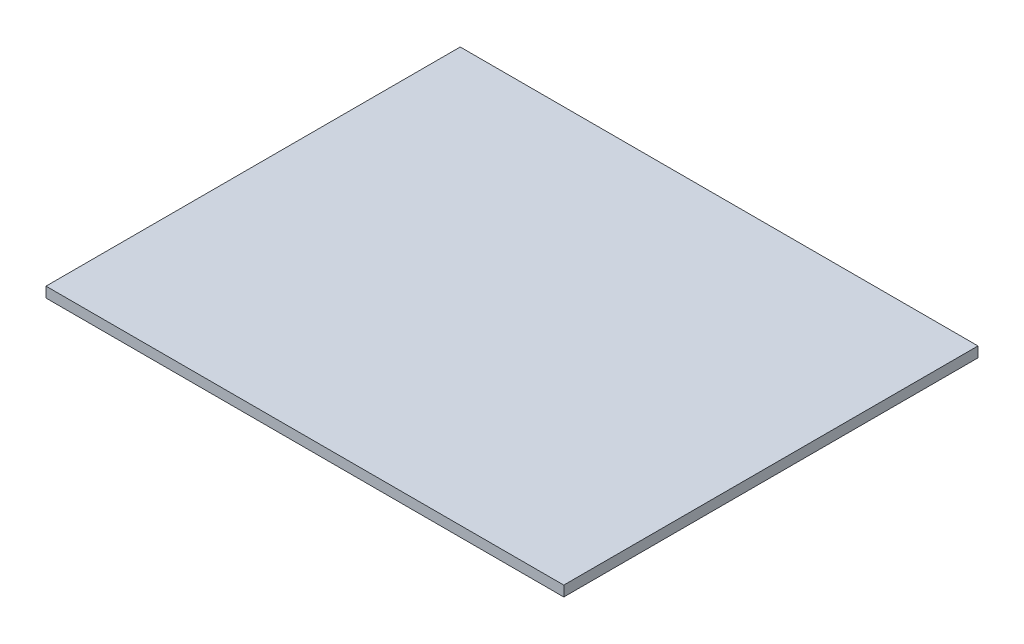
ISO-10303-21;
HEADER;
FILE_DESCRIPTION(('STEP AP214'),'2;1');
FILE_NAME('part.step','',(''),(''),'','','');
FILE_SCHEMA(('AUTOMOTIVE_DESIGN { 1 0 10303 214 1 1 1 1 }'));
ENDSEC;
DATA;
#1=APPLICATION_CONTEXT('core data for automotive mechanical design processes');
#2=APPLICATION_PROTOCOL_DEFINITION('international standard','automotive_design',2000,#1);
#3=PRODUCT_CONTEXT('',#1,'mechanical');
#4=PRODUCT('Part','Part','',(#3));
#5=PRODUCT_RELATED_PRODUCT_CATEGORY('part','',(#4));
#6=PRODUCT_DEFINITION_FORMATION('','',#4);
#7=PRODUCT_DEFINITION_CONTEXT('part definition',#1,'design');
#8=PRODUCT_DEFINITION('design','',#6,#7);
#9=PRODUCT_DEFINITION_SHAPE('','',#8);
#10=(LENGTH_UNIT() NAMED_UNIT(*) SI_UNIT(.MILLI.,.METRE.));
#11=(NAMED_UNIT(*) PLANE_ANGLE_UNIT() SI_UNIT($,.RADIAN.));
#12=(NAMED_UNIT(*) SI_UNIT($,.STERADIAN.) SOLID_ANGLE_UNIT());
#13=UNCERTAINTY_MEASURE_WITH_UNIT(LENGTH_MEASURE(1.E-05),#10,'distance_accuracy_value','');
#14=(GEOMETRIC_REPRESENTATION_CONTEXT(3) GLOBAL_UNCERTAINTY_ASSIGNED_CONTEXT((#13)) GLOBAL_UNIT_ASSIGNED_CONTEXT((#10,
#11,#12)) REPRESENTATION_CONTEXT('',''));
#15=CARTESIAN_POINT('',(0.,0.,0.));
#16=DIRECTION('',(0.,0.,1.));
#17=DIRECTION('',(1.,0.,0.));
#18=AXIS2_PLACEMENT_3D('',#15,#16,#17);
#19=CARTESIAN_POINT('',(-350.,-13.5,200.));
#20=DIRECTION('',(0.,1.,0.));
#21=DIRECTION('',(0.,0.,1.));
#22=AXIS2_PLACEMENT_3D('',#19,#20,#21);
#23=PLANE('',#22);
#24=DIRECTION('',(1.,0.,0.));
#25=VECTOR('',#24,1.);
#26=CARTESIAN_POINT('',(-350.,-13.5,-200.));
#27=LINE('',#26,#25);
#28=CARTESIAN_POINT('',(-350.,-13.5,-200.));
#29=VERTEX_POINT('',#28);
#30=CARTESIAN_POINT('',(150.,-13.5,-200.));
#31=VERTEX_POINT('',#30);
#32=EDGE_CURVE('E102',#29,#31,#27,.T.);
#33=ORIENTED_EDGE('',*,*,#32,.T.);
#34=DIRECTION('',(0.,0.,-1.));
#35=VECTOR('',#34,1.);
#36=CARTESIAN_POINT('',(150.,-13.5,200.));
#37=LINE('',#36,#35);
#38=CARTESIAN_POINT('',(150.,-13.5,200.));
#39=VERTEX_POINT('',#38);
#40=EDGE_CURVE('E11',#39,#31,#37,.T.);
#41=ORIENTED_EDGE('',*,*,#40,.F.);
#42=DIRECTION('',(1.,0.,0.));
#43=VECTOR('',#42,1.);
#44=CARTESIAN_POINT('',(-350.,-13.5,200.));
#45=LINE('',#44,#43);
#46=CARTESIAN_POINT('',(-350.,-13.5,200.));
#47=VERTEX_POINT('',#46);
#48=EDGE_CURVE('E79',#47,#39,#45,.T.);
#49=ORIENTED_EDGE('',*,*,#48,.F.);
#50=DIRECTION('',(0.,0.,-1.));
#51=VECTOR('',#50,1.);
#52=CARTESIAN_POINT('',(-350.,-13.5,200.));
#53=LINE('',#52,#51);
#54=EDGE_CURVE('E55',#47,#29,#53,.T.);
#55=ORIENTED_EDGE('',*,*,#54,.T.);
#56=EDGE_LOOP('',(#33,#41,#49,#55));
#57=FACE_BOUND('',#56,.T.);
#58=ADVANCED_FACE('F39',(#57),#23,.F.);
#59=CARTESIAN_POINT('',(150.,-3.5,200.));
#60=DIRECTION('',(1.,0.,0.));
#61=DIRECTION('',(0.,1.,0.));
#62=AXIS2_PLACEMENT_3D('',#59,#60,#61);
#63=PLANE('',#62);
#64=DIRECTION('',(0.,-1.,0.));
#65=VECTOR('',#64,1.);
#66=CARTESIAN_POINT('',(150.,-3.5,-200.));
#67=LINE('',#66,#65);
#68=CARTESIAN_POINT('',(150.,-3.5,-200.));
#69=VERTEX_POINT('',#68);
#70=EDGE_CURVE('E88',#69,#31,#67,.T.);
#71=ORIENTED_EDGE('',*,*,#70,.F.);
#72=DIRECTION('',(0.,0.,-1.));
#73=VECTOR('',#72,1.);
#74=CARTESIAN_POINT('',(150.,-3.5,200.));
#75=LINE('',#74,#73);
#76=CARTESIAN_POINT('',(150.,-3.5,200.));
#77=VERTEX_POINT('',#76);
#78=EDGE_CURVE('E47',#77,#69,#75,.T.);
#79=ORIENTED_EDGE('',*,*,#78,.F.);
#80=DIRECTION('',(0.,-1.,0.));
#81=VECTOR('',#80,1.);
#82=CARTESIAN_POINT('',(150.,-3.5,200.));
#83=LINE('',#82,#81);
#84=EDGE_CURVE('E86',#77,#39,#83,.T.);
#85=ORIENTED_EDGE('',*,*,#84,.T.);
#86=ORIENTED_EDGE('',*,*,#40,.T.);
#87=EDGE_LOOP('',(#71,#79,#85,#86));
#88=FACE_BOUND('',#87,.T.);
#89=ADVANCED_FACE('F85',(#88),#63,.T.);
#90=CARTESIAN_POINT('',(-350.,-3.5,200.));
#91=DIRECTION('',(0.,1.,0.));
#92=DIRECTION('',(0.,0.,1.));
#93=AXIS2_PLACEMENT_3D('',#90,#91,#92);
#94=PLANE('',#93);
#95=DIRECTION('',(1.,0.,0.));
#96=VECTOR('',#95,1.);
#97=CARTESIAN_POINT('',(-350.,-3.5,-200.));
#98=LINE('',#97,#96);
#99=CARTESIAN_POINT('',(-350.,-3.5,-200.));
#100=VERTEX_POINT('',#99);
#101=EDGE_CURVE('E105',#100,#69,#98,.T.);
#102=ORIENTED_EDGE('',*,*,#101,.F.);
#103=DIRECTION('',(0.,0.,-1.));
#104=VECTOR('',#103,1.);
#105=CARTESIAN_POINT('',(-350.,-3.5,200.));
#106=LINE('',#105,#104);
#107=CARTESIAN_POINT('',(-350.,-3.5,200.));
#108=VERTEX_POINT('',#107);
#109=EDGE_CURVE('E68',#108,#100,#106,.T.);
#110=ORIENTED_EDGE('',*,*,#109,.F.);
#111=DIRECTION('',(1.,0.,0.));
#112=VECTOR('',#111,1.);
#113=CARTESIAN_POINT('',(-350.,-3.5,200.));
#114=LINE('',#113,#112);
#115=EDGE_CURVE('E94',#108,#77,#114,.T.);
#116=ORIENTED_EDGE('',*,*,#115,.T.);
#117=ORIENTED_EDGE('',*,*,#78,.T.);
#118=EDGE_LOOP('',(#102,#110,#116,#117));
#119=FACE_BOUND('',#118,.T.);
#120=ADVANCED_FACE('F96',(#119),#94,.T.);
#121=CARTESIAN_POINT('',(-350.,-13.5,200.));
#122=DIRECTION('',(-1.,0.,0.));
#123=DIRECTION('',(0.,0.,1.));
#124=AXIS2_PLACEMENT_3D('',#121,#122,#123);
#125=PLANE('',#124);
#126=DIRECTION('',(0.,1.,0.));
#127=VECTOR('',#126,1.);
#128=CARTESIAN_POINT('',(-350.,-13.5,-200.));
#129=LINE('',#128,#127);
#130=EDGE_CURVE('E107',#29,#100,#129,.T.);
#131=ORIENTED_EDGE('',*,*,#130,.F.);
#132=ORIENTED_EDGE('',*,*,#54,.F.);
#133=DIRECTION('',(0.,1.,0.));
#134=VECTOR('',#133,1.);
#135=CARTESIAN_POINT('',(-350.,-13.5,200.));
#136=LINE('',#135,#134);
#137=EDGE_CURVE('E97',#47,#108,#136,.T.);
#138=ORIENTED_EDGE('',*,*,#137,.T.);
#139=ORIENTED_EDGE('',*,*,#109,.T.);
#140=EDGE_LOOP('',(#131,#132,#138,#139));
#141=FACE_BOUND('',#140,.T.);
#142=ADVANCED_FACE('F113',(#141),#125,.T.);
#143=CARTESIAN_POINT('',(0.,0.,200.));
#144=DIRECTION('',(0.,0.,-1.));
#145=DIRECTION('',(-1.,0.,0.));
#146=AXIS2_PLACEMENT_3D('',#143,#144,#145);
#147=PLANE('',#146);
#148=ORIENTED_EDGE('',*,*,#48,.T.);
#149=ORIENTED_EDGE('',*,*,#84,.F.);
#150=ORIENTED_EDGE('',*,*,#115,.F.);
#151=ORIENTED_EDGE('',*,*,#137,.F.);
#152=EDGE_LOOP('',(#148,#149,#150,#151));
#153=FACE_BOUND('',#152,.T.);
#154=ADVANCED_FACE('F93',(#153),#147,.F.);
#155=CARTESIAN_POINT('',(0.,0.,-200.));
#156=DIRECTION('',(0.,0.,-1.));
#157=DIRECTION('',(-1.,0.,0.));
#158=AXIS2_PLACEMENT_3D('',#155,#156,#157);
#159=PLANE('',#158);
#160=ORIENTED_EDGE('',*,*,#32,.F.);
#161=ORIENTED_EDGE('',*,*,#130,.T.);
#162=ORIENTED_EDGE('',*,*,#101,.T.);
#163=ORIENTED_EDGE('',*,*,#70,.T.);
#164=EDGE_LOOP('',(#160,#161,#162,#163));
#165=FACE_BOUND('',#164,.T.);
#166=ADVANCED_FACE('F112',(#165),#159,.T.);
#167=CLOSED_SHELL('',(#58,#89,#120,#142,#154,#166));
#168=MANIFOLD_SOLID_BREP('B2',#167);
#169=ADVANCED_BREP_SHAPE_REPRESENTATION('',(#18,#168),#14);
#170=SHAPE_DEFINITION_REPRESENTATION(#9,#169);
ENDSEC;
END-ISO-10303-21;
